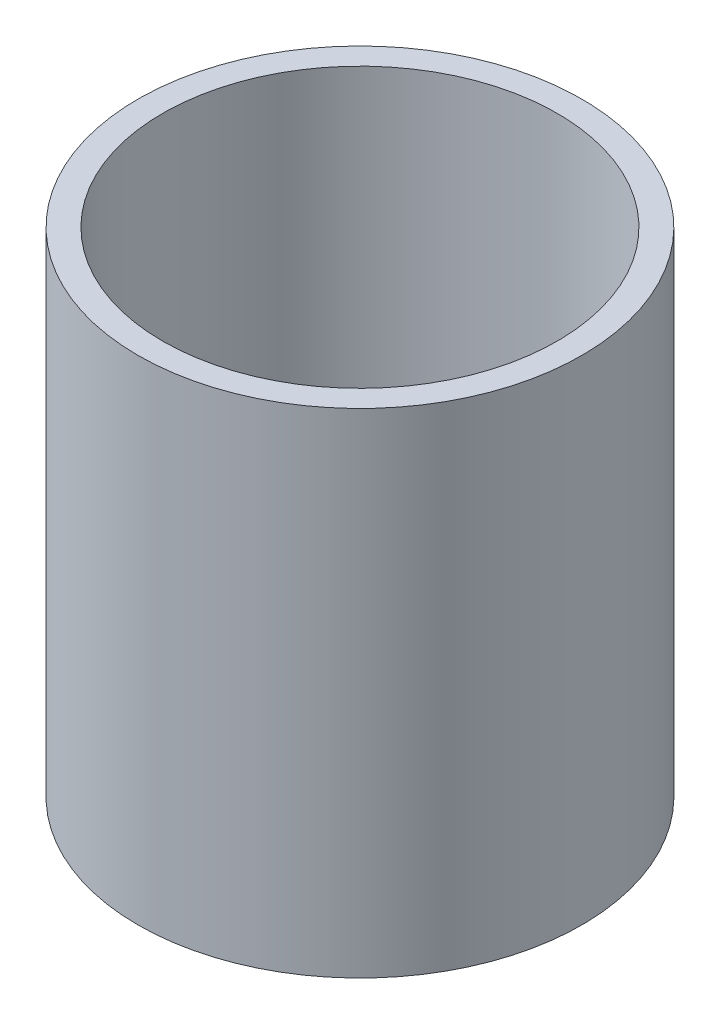
ISO-10303-21;
HEADER;
FILE_DESCRIPTION(('STEP AP214'),'2;1');
FILE_NAME('part.step','',(''),(''),'','','');
FILE_SCHEMA(('AUTOMOTIVE_DESIGN { 1 0 10303 214 1 1 1 1 }'));
ENDSEC;
DATA;
#1=APPLICATION_CONTEXT('core data for automotive mechanical design processes');
#2=APPLICATION_PROTOCOL_DEFINITION('international standard','automotive_design',2000,#1);
#3=PRODUCT_CONTEXT('',#1,'mechanical');
#4=PRODUCT('Part','Part','',(#3));
#5=PRODUCT_RELATED_PRODUCT_CATEGORY('part','',(#4));
#6=PRODUCT_DEFINITION_FORMATION('','',#4);
#7=PRODUCT_DEFINITION_CONTEXT('part definition',#1,'design');
#8=PRODUCT_DEFINITION('design','',#6,#7);
#9=PRODUCT_DEFINITION_SHAPE('','',#8);
#10=(LENGTH_UNIT() NAMED_UNIT(*) SI_UNIT(.MILLI.,.METRE.));
#11=(NAMED_UNIT(*) PLANE_ANGLE_UNIT() SI_UNIT($,.RADIAN.));
#12=(NAMED_UNIT(*) SI_UNIT($,.STERADIAN.) SOLID_ANGLE_UNIT());
#13=UNCERTAINTY_MEASURE_WITH_UNIT(LENGTH_MEASURE(1.E-05),#10,'distance_accuracy_value','');
#14=(GEOMETRIC_REPRESENTATION_CONTEXT(3) GLOBAL_UNCERTAINTY_ASSIGNED_CONTEXT((#13)) GLOBAL_UNIT_ASSIGNED_CONTEXT((#10,
#11,#12)) REPRESENTATION_CONTEXT('',''));
#15=CARTESIAN_POINT('',(0.,0.,0.));
#16=DIRECTION('',(0.,0.,1.));
#17=DIRECTION('',(1.,0.,0.));
#18=AXIS2_PLACEMENT_3D('',#15,#16,#17);
#19=CARTESIAN_POINT('',(0.,20.,0.));
#20=DIRECTION('',(0.,-1.,0.));
#21=DIRECTION('',(0.,0.,-1.));
#22=AXIS2_PLACEMENT_3D('',#19,#20,#21);
#23=CYLINDRICAL_SURFACE('',#22,9.);
#24=CARTESIAN_POINT('',(0.,20.,0.));
#25=DIRECTION('',(0.,1.,0.));
#26=DIRECTION('',(0.,0.,1.));
#27=AXIS2_PLACEMENT_3D('',#24,#25,#26);
#28=CIRCLE('',#27,9.);
#29=CARTESIAN_POINT('',(0.,20.,9.));
#30=VERTEX_POINT('',#29);
#31=EDGE_CURVE('E10',#30,#30,#28,.T.);
#32=ORIENTED_EDGE('',*,*,#31,.F.);
#33=EDGE_LOOP('',(#32));
#34=FACE_BOUND('',#33,.T.);
#35=CARTESIAN_POINT('',(0.,0.,0.));
#36=DIRECTION('',(0.,1.,0.));
#37=DIRECTION('',(0.,0.,1.));
#38=AXIS2_PLACEMENT_3D('',#35,#36,#37);
#39=CIRCLE('',#38,9.);
#40=CARTESIAN_POINT('',(0.,0.,9.));
#41=VERTEX_POINT('',#40);
#42=EDGE_CURVE('E40',#41,#41,#39,.T.);
#43=ORIENTED_EDGE('',*,*,#42,.T.);
#44=EDGE_LOOP('',(#43));
#45=FACE_BOUND('',#44,.T.);
#46=ADVANCED_FACE('F37',(#34,#45),#23,.T.);
#47=CARTESIAN_POINT('',(0.,20.,0.));
#48=DIRECTION('',(0.,1.,0.));
#49=DIRECTION('',(0.,0.,1.));
#50=AXIS2_PLACEMENT_3D('',#47,#48,#49);
#51=PLANE('',#50);
#52=CARTESIAN_POINT('',(0.,20.,0.));
#53=DIRECTION('',(0.,1.,0.));
#54=DIRECTION('',(0.,0.,1.));
#55=AXIS2_PLACEMENT_3D('',#52,#53,#54);
#56=CIRCLE('',#55,8.);
#57=CARTESIAN_POINT('',(0.,20.,8.));
#58=VERTEX_POINT('',#57);
#59=EDGE_CURVE('E51',#58,#58,#56,.T.);
#60=ORIENTED_EDGE('',*,*,#59,.F.);
#61=EDGE_LOOP('',(#60));
#62=FACE_BOUND('',#61,.T.);
#63=ORIENTED_EDGE('',*,*,#31,.T.);
#64=EDGE_LOOP('',(#63));
#65=FACE_BOUND('',#64,.T.);
#66=ADVANCED_FACE('F68',(#62,#65),#51,.T.);
#67=CARTESIAN_POINT('',(0.,0.,0.));
#68=DIRECTION('',(0.,1.,0.));
#69=DIRECTION('',(0.,0.,1.));
#70=AXIS2_PLACEMENT_3D('',#67,#68,#69);
#71=PLANE('',#70);
#72=CARTESIAN_POINT('',(0.,0.,0.));
#73=DIRECTION('',(0.,1.,0.));
#74=DIRECTION('',(0.,0.,1.));
#75=AXIS2_PLACEMENT_3D('',#72,#73,#74);
#76=CIRCLE('',#75,8.);
#77=CARTESIAN_POINT('',(0.,0.,8.));
#78=VERTEX_POINT('',#77);
#79=EDGE_CURVE('E49',#78,#78,#76,.T.);
#80=ORIENTED_EDGE('',*,*,#79,.T.);
#81=EDGE_LOOP('',(#80));
#82=FACE_BOUND('',#81,.T.);
#83=ORIENTED_EDGE('',*,*,#42,.F.);
#84=EDGE_LOOP('',(#83));
#85=FACE_BOUND('',#84,.T.);
#86=ADVANCED_FACE('F59',(#82,#85),#71,.F.);
#87=CARTESIAN_POINT('',(0.,0.,0.));
#88=DIRECTION('',(0.,1.,0.));
#89=DIRECTION('',(0.,0.,1.));
#90=AXIS2_PLACEMENT_3D('',#87,#88,#89);
#91=CYLINDRICAL_SURFACE('',#90,8.);
#92=ORIENTED_EDGE('',*,*,#79,.F.);
#93=EDGE_LOOP('',(#92));
#94=FACE_BOUND('',#93,.T.);
#95=ORIENTED_EDGE('',*,*,#59,.T.);
#96=EDGE_LOOP('',(#95));
#97=FACE_BOUND('',#96,.T.);
#98=ADVANCED_FACE('F62',(#94,#97),#91,.F.);
#99=CLOSED_SHELL('',(#46,#66,#86,#98));
#100=MANIFOLD_SOLID_BREP('B2',#99);
#101=ADVANCED_BREP_SHAPE_REPRESENTATION('',(#18,#100),#14);
#102=SHAPE_DEFINITION_REPRESENTATION(#9,#101);
ENDSEC;
END-ISO-10303-21;
